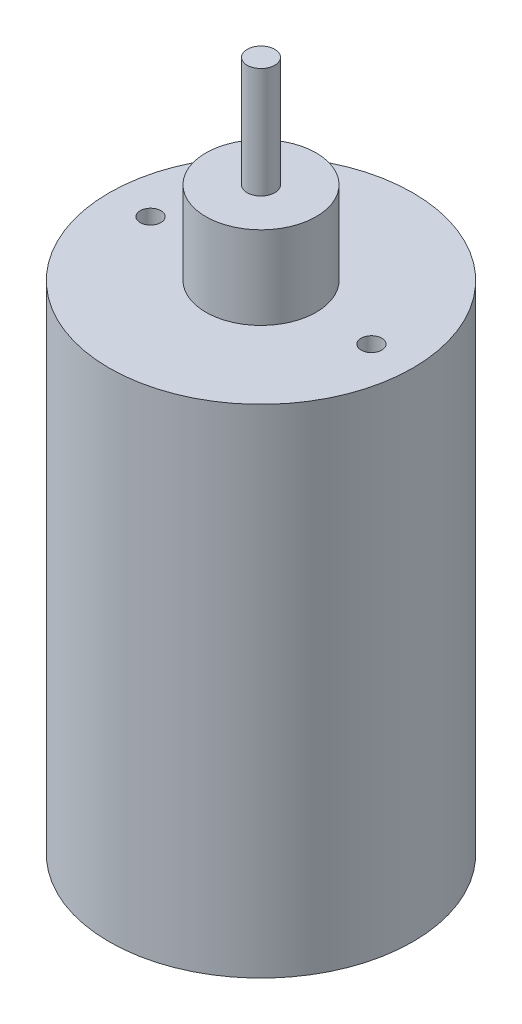
ISO-10303-21;
HEADER;
FILE_DESCRIPTION(('STEP AP214'),'2;1');
FILE_NAME('part.step','',(''),(''),'','','');
FILE_SCHEMA(('AUTOMOTIVE_DESIGN { 1 0 10303 214 1 1 1 1 }'));
ENDSEC;
DATA;
#1=APPLICATION_CONTEXT('core data for automotive mechanical design processes');
#2=APPLICATION_PROTOCOL_DEFINITION('international standard','automotive_design',2000,#1);
#3=PRODUCT_CONTEXT('',#1,'mechanical');
#4=PRODUCT('Part','Part','',(#3));
#5=PRODUCT_RELATED_PRODUCT_CATEGORY('part','',(#4));
#6=PRODUCT_DEFINITION_FORMATION('','',#4);
#7=PRODUCT_DEFINITION_CONTEXT('part definition',#1,'design');
#8=PRODUCT_DEFINITION('design','',#6,#7);
#9=PRODUCT_DEFINITION_SHAPE('','',#8);
#10=(LENGTH_UNIT() NAMED_UNIT(*) SI_UNIT(.MILLI.,.METRE.));
#11=(NAMED_UNIT(*) PLANE_ANGLE_UNIT() SI_UNIT($,.RADIAN.));
#12=(NAMED_UNIT(*) SI_UNIT($,.STERADIAN.) SOLID_ANGLE_UNIT());
#13=UNCERTAINTY_MEASURE_WITH_UNIT(LENGTH_MEASURE(1.E-05),#10,'distance_accuracy_value','');
#14=(GEOMETRIC_REPRESENTATION_CONTEXT(3) GLOBAL_UNCERTAINTY_ASSIGNED_CONTEXT((#13)) GLOBAL_UNIT_ASSIGNED_CONTEXT((#10,
#11,#12)) REPRESENTATION_CONTEXT('',''));
#15=CARTESIAN_POINT('',(0.,0.,0.));
#16=DIRECTION('',(0.,0.,1.));
#17=DIRECTION('',(1.,0.,0.));
#18=AXIS2_PLACEMENT_3D('',#15,#16,#17);
#19=CARTESIAN_POINT('',(0.,57.15,0.));
#20=DIRECTION('',(0.,-1.,0.));
#21=DIRECTION('',(0.,0.,-1.));
#22=AXIS2_PLACEMENT_3D('',#19,#20,#21);
#23=CYLINDRICAL_SURFACE('',#22,17.4625);
#24=CARTESIAN_POINT('',(0.,57.15,0.));
#25=DIRECTION('',(0.,1.,0.));
#26=DIRECTION('',(0.,0.,1.));
#27=AXIS2_PLACEMENT_3D('',#24,#25,#26);
#28=CIRCLE('',#27,17.4625);
#29=CARTESIAN_POINT('',(0.,57.15,17.4625));
#30=VERTEX_POINT('',#29);
#31=EDGE_CURVE('E10',#30,#30,#28,.T.);
#32=ORIENTED_EDGE('',*,*,#31,.F.);
#33=EDGE_LOOP('',(#32));
#34=FACE_BOUND('',#33,.T.);
#35=CARTESIAN_POINT('',(0.,0.,0.));
#36=DIRECTION('',(0.,1.,0.));
#37=DIRECTION('',(0.,0.,1.));
#38=AXIS2_PLACEMENT_3D('',#35,#36,#37);
#39=CIRCLE('',#38,17.4625);
#40=CARTESIAN_POINT('',(0.,0.,17.4625));
#41=VERTEX_POINT('',#40);
#42=EDGE_CURVE('E33',#41,#41,#39,.T.);
#43=ORIENTED_EDGE('',*,*,#42,.T.);
#44=EDGE_LOOP('',(#43));
#45=FACE_BOUND('',#44,.T.);
#46=ADVANCED_FACE('F30',(#34,#45),#23,.T.);
#47=CARTESIAN_POINT('',(0.,57.15,0.));
#48=DIRECTION('',(0.,1.,0.));
#49=DIRECTION('',(0.,0.,1.));
#50=AXIS2_PLACEMENT_3D('',#47,#48,#49);
#51=PLANE('',#50);
#52=CARTESIAN_POINT('',(-12.7,57.15,0.));
#53=DIRECTION('',(0.,1.,0.));
#54=DIRECTION('',(0.,0.,1.));
#55=AXIS2_PLACEMENT_3D('',#52,#53,#54);
#56=CIRCLE('',#55,1.190625);
#57=CARTESIAN_POINT('',(-12.7,57.15,1.190625));
#58=VERTEX_POINT('',#57);
#59=EDGE_CURVE('E60',#58,#58,#56,.T.);
#60=ORIENTED_EDGE('',*,*,#59,.F.);
#61=EDGE_LOOP('',(#60));
#62=FACE_BOUND('',#61,.T.);
#63=CARTESIAN_POINT('',(12.7,57.15,0.));
#64=DIRECTION('',(0.,1.,0.));
#65=DIRECTION('',(0.,0.,1.));
#66=AXIS2_PLACEMENT_3D('',#63,#64,#65);
#67=CIRCLE('',#66,1.190625);
#68=CARTESIAN_POINT('',(12.7,57.15,1.190625));
#69=VERTEX_POINT('',#68);
#70=EDGE_CURVE('E54',#69,#69,#67,.T.);
#71=ORIENTED_EDGE('',*,*,#70,.F.);
#72=EDGE_LOOP('',(#71));
#73=FACE_BOUND('',#72,.T.);
#74=CARTESIAN_POINT('',(0.,57.15,0.));
#75=DIRECTION('',(0.,1.,0.));
#76=DIRECTION('',(0.,0.,1.));
#77=AXIS2_PLACEMENT_3D('',#74,#75,#76);
#78=CIRCLE('',#77,6.35);
#79=CARTESIAN_POINT('',(0.,57.15,-6.35));
#80=VERTEX_POINT('',#79);
#81=EDGE_CURVE('E42',#80,#80,#78,.T.);
#82=ORIENTED_EDGE('',*,*,#81,.F.);
#83=EDGE_LOOP('',(#82));
#84=FACE_BOUND('',#83,.T.);
#85=ORIENTED_EDGE('',*,*,#31,.T.);
#86=EDGE_LOOP('',(#85));
#87=FACE_BOUND('',#86,.T.);
#88=ADVANCED_FACE('F75',(#62,#73,#84,#87),#51,.T.);
#89=CARTESIAN_POINT('',(0.,0.,0.));
#90=DIRECTION('',(0.,1.,0.));
#91=DIRECTION('',(0.,0.,1.));
#92=AXIS2_PLACEMENT_3D('',#89,#90,#91);
#93=PLANE('',#92);
#94=ORIENTED_EDGE('',*,*,#42,.F.);
#95=EDGE_LOOP('',(#94));
#96=FACE_BOUND('',#95,.T.);
#97=ADVANCED_FACE('F78',(#96),#93,.F.);
#98=CARTESIAN_POINT('',(0.,66.675,0.));
#99=DIRECTION('',(0.,-1.,0.));
#100=DIRECTION('',(0.,0.,-1.));
#101=AXIS2_PLACEMENT_3D('',#98,#99,#100);
#102=CYLINDRICAL_SURFACE('',#101,6.35);
#103=CARTESIAN_POINT('',(0.,66.675,0.));
#104=DIRECTION('',(0.,1.,0.));
#105=DIRECTION('',(0.,0.,1.));
#106=AXIS2_PLACEMENT_3D('',#103,#104,#105);
#107=CIRCLE('',#106,6.35);
#108=CARTESIAN_POINT('',(0.,66.675,-6.35));
#109=VERTEX_POINT('',#108);
#110=EDGE_CURVE('E40',#109,#109,#107,.T.);
#111=CARTESIAN_POINT('',(0.,66.675,-6.35));
#112=CARTESIAN_POINT('',(0.,66.57578125,-6.35));
#113=CARTESIAN_POINT('',(0.,66.4765625,-6.35));
#114=CARTESIAN_POINT('',(0.,66.278125,-6.35));
#115=CARTESIAN_POINT('',(0.,66.17890625,-6.35));
#116=CARTESIAN_POINT('',(0.,65.98046875,-6.35));
#117=CARTESIAN_POINT('',(0.,65.88125,-6.35));
#118=CARTESIAN_POINT('',(0.,65.6828125,-6.35));
#119=CARTESIAN_POINT('',(0.,65.58359375,-6.35));
#120=CARTESIAN_POINT('',(0.,65.38515625,-6.35));
#121=CARTESIAN_POINT('',(0.,65.2859375,-6.35));
#122=CARTESIAN_POINT('',(0.,65.0875,-6.35));
#123=CARTESIAN_POINT('',(0.,64.98828125,-6.35));
#124=CARTESIAN_POINT('',(0.,64.78984375,-6.35));
#125=CARTESIAN_POINT('',(0.,64.690625,-6.35));
#126=CARTESIAN_POINT('',(0.,64.4921875,-6.35));
#127=CARTESIAN_POINT('',(0.,64.39296875,-6.35));
#128=CARTESIAN_POINT('',(0.,64.19453125,-6.35));
#129=CARTESIAN_POINT('',(0.,64.0953125,-6.35));
#130=CARTESIAN_POINT('',(0.,63.896875,-6.35));
#131=CARTESIAN_POINT('',(0.,63.79765625,-6.35));
#132=CARTESIAN_POINT('',(0.,63.59921875,-6.35));
#133=CARTESIAN_POINT('',(0.,63.5,-6.35));
#134=CARTESIAN_POINT('',(0.,63.3015625,-6.35));
#135=CARTESIAN_POINT('',(0.,63.20234375,-6.35));
#136=CARTESIAN_POINT('',(0.,63.00390625,-6.35));
#137=CARTESIAN_POINT('',(0.,62.9046875,-6.35));
#138=CARTESIAN_POINT('',(0.,62.70625,-6.35));
#139=CARTESIAN_POINT('',(0.,62.60703125,-6.35));
#140=CARTESIAN_POINT('',(0.,62.40859375,-6.35));
#141=CARTESIAN_POINT('',(0.,62.309375,-6.35));
#142=CARTESIAN_POINT('',(0.,62.1109375,-6.35));
#143=CARTESIAN_POINT('',(0.,62.01171875,-6.35));
#144=CARTESIAN_POINT('',(0.,61.81328125,-6.35));
#145=CARTESIAN_POINT('',(0.,61.7140625,-6.35));
#146=CARTESIAN_POINT('',(0.,61.515625,-6.35));
#147=CARTESIAN_POINT('',(0.,61.41640625,-6.35));
#148=CARTESIAN_POINT('',(0.,61.21796875,-6.35));
#149=CARTESIAN_POINT('',(0.,61.11875,-6.35));
#150=CARTESIAN_POINT('',(0.,60.9203125,-6.35));
#151=CARTESIAN_POINT('',(0.,60.82109375,-6.35));
#152=CARTESIAN_POINT('',(0.,60.62265625,-6.35));
#153=CARTESIAN_POINT('',(0.,60.5234375,-6.35));
#154=CARTESIAN_POINT('',(0.,60.325,-6.35));
#155=CARTESIAN_POINT('',(0.,60.22578125,-6.35));
#156=CARTESIAN_POINT('',(0.,60.02734375,-6.35));
#157=CARTESIAN_POINT('',(0.,59.928125,-6.35));
#158=CARTESIAN_POINT('',(0.,59.7296875,-6.35));
#159=CARTESIAN_POINT('',(0.,59.63046875,-6.35));
#160=CARTESIAN_POINT('',(0.,59.43203125,-6.35));
#161=CARTESIAN_POINT('',(0.,59.3328125,-6.35));
#162=CARTESIAN_POINT('',(0.,59.134375,-6.35));
#163=CARTESIAN_POINT('',(0.,59.03515625,-6.35));
#164=CARTESIAN_POINT('',(0.,58.83671875,-6.35));
#165=CARTESIAN_POINT('',(0.,58.7375,-6.35));
#166=CARTESIAN_POINT('',(0.,58.5390625,-6.35));
#167=CARTESIAN_POINT('',(0.,58.43984375,-6.35));
#168=CARTESIAN_POINT('',(0.,58.24140625,-6.35));
#169=CARTESIAN_POINT('',(0.,58.1421875,-6.35));
#170=CARTESIAN_POINT('',(0.,57.94375,-6.35));
#171=CARTESIAN_POINT('',(0.,57.84453125,-6.35));
#172=CARTESIAN_POINT('',(0.,57.64609375,-6.35));
#173=CARTESIAN_POINT('',(0.,57.546875,-6.35));
#174=CARTESIAN_POINT('',(0.,57.3484375,-6.35));
#175=CARTESIAN_POINT('',(0.,57.24921875,-6.35));
#176=CARTESIAN_POINT('',(0.,57.15,-6.35));
#177=B_SPLINE_CURVE_WITH_KNOTS('',3,(#111,#112,#113,#114,#115,#116,#117,#118,#119,#120,#121,
#122,#123,#124,#125,#126,#127,#128,#129,#130,#131,#132,#133,#134,#135,#136,#137,#138,#139,#140,
#141,#142,#143,#144,#145,#146,#147,#148,#149,#150,#151,#152,#153,#154,#155,#156,#157,#158,#159,
#160,#161,#162,#163,#164,#165,#166,#167,#168,#169,#170,#171,#172,#173,#174,#175,#176),
.UNSPECIFIED.,.F.,.F.,(4,2,2,2,2,2,2,2,2,2,2,2,2,2,2,2,2,2,2,2,2,2,2,2,2,2,2,2,2,2,2,2,4),(0.,
0.297656249999986,0.595312499999986,0.892968749999987,1.19062499999999,1.48828124999999,
1.78593749999999,2.08359374999999,2.38124999999999,2.67890624999999,2.97656249999999,
3.27421874999999,3.57187499999999,3.86953124999999,4.16718749999999,4.46484374999999,
4.76249999999999,5.06015624999999,5.35781249999999,5.65546874999999,5.95312499999999,
6.25078124999999,6.54843749999999,6.84609374999999,7.14374999999999,7.44140624999999,
7.73906249999999,8.03671874999999,8.33437499999999,8.63203124999999,8.92968749999998,
9.22734374999999,9.52499999999998),.UNSPECIFIED.);
#178=EDGE_CURVE('BSEAM84',#109,#80,#177,.T.);
#179=ORIENTED_EDGE('',*,*,#110,.F.);
#180=ORIENTED_EDGE('',*,*,#81,.T.);
#181=ORIENTED_EDGE('',*,*,#178,.T.);
#182=ORIENTED_EDGE('',*,*,#178,.F.);
#183=EDGE_LOOP('',(#179,#181,#180,#182));
#184=FACE_BOUND('',#183,.T.);
#185=ADVANCED_FACE('F84',(#184),#102,.T.);
#186=CARTESIAN_POINT('',(0.,66.675,0.));
#187=DIRECTION('',(0.,1.,0.));
#188=DIRECTION('',(0.,0.,1.));
#189=AXIS2_PLACEMENT_3D('',#186,#187,#188);
#190=PLANE('',#189);
#191=CARTESIAN_POINT('',(0.,66.675,0.));
#192=DIRECTION('',(0.,1.,0.));
#193=DIRECTION('',(0.,0.,1.));
#194=AXIS2_PLACEMENT_3D('',#191,#192,#193);
#195=CIRCLE('',#194,1.5875);
#196=CARTESIAN_POINT('',(0.,66.675,1.5875));
#197=VERTEX_POINT('',#196);
#198=EDGE_CURVE('E48',#197,#197,#195,.T.);
#199=ORIENTED_EDGE('',*,*,#198,.F.);
#200=EDGE_LOOP('',(#199));
#201=FACE_BOUND('',#200,.T.);
#202=ORIENTED_EDGE('',*,*,#110,.T.);
#203=EDGE_LOOP('',(#202));
#204=FACE_BOUND('',#203,.T.);
#205=ADVANCED_FACE('F86',(#201,#204),#190,.T.);
#206=CARTESIAN_POINT('',(0.,79.375,0.));
#207=DIRECTION('',(0.,-1.,0.));
#208=DIRECTION('',(0.,0.,-1.));
#209=AXIS2_PLACEMENT_3D('',#206,#207,#208);
#210=CYLINDRICAL_SURFACE('',#209,1.5875);
#211=CARTESIAN_POINT('',(0.,79.375,0.));
#212=DIRECTION('',(0.,1.,0.));
#213=DIRECTION('',(0.,0.,1.));
#214=AXIS2_PLACEMENT_3D('',#211,#212,#213);
#215=CIRCLE('',#214,1.5875);
#216=CARTESIAN_POINT('',(0.,79.375,1.5875));
#217=VERTEX_POINT('',#216);
#218=EDGE_CURVE('E45',#217,#217,#215,.T.);
#219=ORIENTED_EDGE('',*,*,#218,.F.);
#220=EDGE_LOOP('',(#219));
#221=FACE_BOUND('',#220,.T.);
#222=ORIENTED_EDGE('',*,*,#198,.T.);
#223=EDGE_LOOP('',(#222));
#224=FACE_BOUND('',#223,.T.);
#225=ADVANCED_FACE('F93',(#221,#224),#210,.T.);
#226=CARTESIAN_POINT('',(0.,79.375,0.));
#227=DIRECTION('',(0.,1.,0.));
#228=DIRECTION('',(0.,0.,1.));
#229=AXIS2_PLACEMENT_3D('',#226,#227,#228);
#230=PLANE('',#229);
#231=ORIENTED_EDGE('',*,*,#218,.T.);
#232=EDGE_LOOP('',(#231));
#233=FACE_BOUND('',#232,.T.);
#234=ADVANCED_FACE('F132',(#233),#230,.T.);
#235=CARTESIAN_POINT('',(12.7,44.45,0.));
#236=DIRECTION('',(0.,1.,0.));
#237=DIRECTION('',(0.,0.,1.));
#238=AXIS2_PLACEMENT_3D('',#235,#236,#237);
#239=CYLINDRICAL_SURFACE('',#238,1.190625);
#240=CARTESIAN_POINT('',(12.7,44.45,0.));
#241=DIRECTION('',(0.,1.,0.));
#242=DIRECTION('',(0.,0.,1.));
#243=AXIS2_PLACEMENT_3D('',#240,#241,#242);
#244=CIRCLE('',#243,1.190625);
#245=CARTESIAN_POINT('',(12.7,44.45,1.190625));
#246=VERTEX_POINT('',#245);
#247=EDGE_CURVE('E51',#246,#246,#244,.T.);
#248=ORIENTED_EDGE('',*,*,#247,.F.);
#249=EDGE_LOOP('',(#248));
#250=FACE_BOUND('',#249,.T.);
#251=ORIENTED_EDGE('',*,*,#70,.T.);
#252=EDGE_LOOP('',(#251));
#253=FACE_BOUND('',#252,.T.);
#254=ADVANCED_FACE('F141',(#250,#253),#239,.F.);
#255=CARTESIAN_POINT('',(12.7,44.45,0.));
#256=DIRECTION('',(0.,1.,0.));
#257=DIRECTION('',(0.,0.,1.));
#258=AXIS2_PLACEMENT_3D('',#255,#256,#257);
#259=PLANE('',#258);
#260=ORIENTED_EDGE('',*,*,#247,.T.);
#261=EDGE_LOOP('',(#260));
#262=FACE_BOUND('',#261,.T.);
#263=ADVANCED_FACE('F71',(#262),#259,.T.);
#264=CARTESIAN_POINT('',(-12.7,44.45,0.));
#265=DIRECTION('',(0.,1.,0.));
#266=DIRECTION('',(0.,0.,1.));
#267=AXIS2_PLACEMENT_3D('',#264,#265,#266);
#268=CYLINDRICAL_SURFACE('',#267,1.190625);
#269=CARTESIAN_POINT('',(-12.7,44.45,0.));
#270=DIRECTION('',(0.,1.,0.));
#271=DIRECTION('',(0.,0.,1.));
#272=AXIS2_PLACEMENT_3D('',#269,#270,#271);
#273=CIRCLE('',#272,1.190625);
#274=CARTESIAN_POINT('',(-12.7,44.45,1.190625));
#275=VERTEX_POINT('',#274);
#276=EDGE_CURVE('E57',#275,#275,#273,.T.);
#277=ORIENTED_EDGE('',*,*,#276,.F.);
#278=EDGE_LOOP('',(#277));
#279=FACE_BOUND('',#278,.T.);
#280=ORIENTED_EDGE('',*,*,#59,.T.);
#281=EDGE_LOOP('',(#280));
#282=FACE_BOUND('',#281,.T.);
#283=ADVANCED_FACE('F68',(#279,#282),#268,.F.);
#284=CARTESIAN_POINT('',(-12.7,44.45,0.));
#285=DIRECTION('',(0.,1.,0.));
#286=DIRECTION('',(0.,0.,1.));
#287=AXIS2_PLACEMENT_3D('',#284,#285,#286);
#288=PLANE('',#287);
#289=ORIENTED_EDGE('',*,*,#276,.T.);
#290=EDGE_LOOP('',(#289));
#291=FACE_BOUND('',#290,.T.);
#292=ADVANCED_FACE('F66',(#291),#288,.T.);
#293=CLOSED_SHELL('',(#46,#88,#97,#185,#205,#225,#234,#254,#263,#283,#292));
#294=MANIFOLD_SOLID_BREP('B2',#293);
#295=ADVANCED_BREP_SHAPE_REPRESENTATION('',(#18,#294),#14);
#296=SHAPE_DEFINITION_REPRESENTATION(#9,#295);
ENDSEC;
END-ISO-10303-21;
